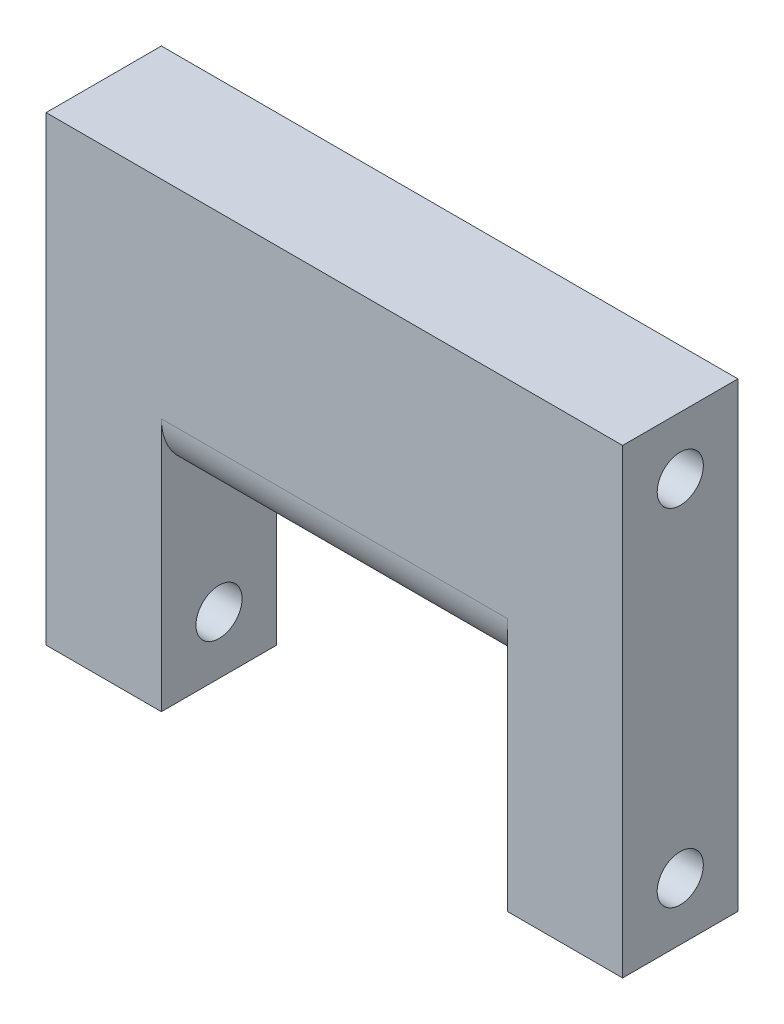
ISO-10303-21;
HEADER;
FILE_DESCRIPTION(('STEP AP214'),'2;1');
FILE_NAME('part.step','',(''),(''),'','','');
FILE_SCHEMA(('AUTOMOTIVE_DESIGN { 1 0 10303 214 1 1 1 1 }'));
ENDSEC;
DATA;
#1=APPLICATION_CONTEXT('core data for automotive mechanical design processes');
#2=APPLICATION_PROTOCOL_DEFINITION('international standard','automotive_design',2000,#1);
#3=PRODUCT_CONTEXT('',#1,'mechanical');
#4=PRODUCT('Part','Part','',(#3));
#5=PRODUCT_RELATED_PRODUCT_CATEGORY('part','',(#4));
#6=PRODUCT_DEFINITION_FORMATION('','',#4);
#7=PRODUCT_DEFINITION_CONTEXT('part definition',#1,'design');
#8=PRODUCT_DEFINITION('design','',#6,#7);
#9=PRODUCT_DEFINITION_SHAPE('','',#8);
#10=(LENGTH_UNIT() NAMED_UNIT(*) SI_UNIT(.MILLI.,.METRE.));
#11=(NAMED_UNIT(*) PLANE_ANGLE_UNIT() SI_UNIT($,.RADIAN.));
#12=(NAMED_UNIT(*) SI_UNIT($,.STERADIAN.) SOLID_ANGLE_UNIT());
#13=UNCERTAINTY_MEASURE_WITH_UNIT(LENGTH_MEASURE(1.E-05),#10,'distance_accuracy_value','');
#14=(GEOMETRIC_REPRESENTATION_CONTEXT(3) GLOBAL_UNCERTAINTY_ASSIGNED_CONTEXT((#13)) GLOBAL_UNIT_ASSIGNED_CONTEXT((#10,
#11,#12)) REPRESENTATION_CONTEXT('',''));
#15=CARTESIAN_POINT('',(0.,0.,0.));
#16=DIRECTION('',(0.,0.,1.));
#17=DIRECTION('',(1.,0.,0.));
#18=AXIS2_PLACEMENT_3D('',#15,#16,#17);
#19=CARTESIAN_POINT('',(0.,0.,10.));
#20=DIRECTION('',(1.,0.,0.));
#21=DIRECTION('',(0.,0.,-1.));
#22=AXIS2_PLACEMENT_3D('',#19,#20,#21);
#23=PLANE('',#22);
#24=CARTESIAN_POINT('',(0.,35.,5.));
#25=DIRECTION('',(-1.,0.,0.));
#26=DIRECTION('',(0.,0.,1.));
#27=AXIS2_PLACEMENT_3D('',#24,#25,#26);
#28=CIRCLE('',#27,2.);
#29=CARTESIAN_POINT('',(0.,35.,7.));
#30=VERTEX_POINT('',#29);
#31=EDGE_CURVE('E186',#30,#30,#28,.T.);
#32=ORIENTED_EDGE('',*,*,#31,.F.);
#33=EDGE_LOOP('',(#32));
#34=FACE_BOUND('',#33,.T.);
#35=CARTESIAN_POINT('',(0.,5.,5.));
#36=DIRECTION('',(1.,0.,0.));
#37=DIRECTION('',(0.,0.,-1.));
#38=AXIS2_PLACEMENT_3D('',#35,#36,#37);
#39=CIRCLE('',#38,2.);
#40=CARTESIAN_POINT('',(0.,5.,3.));
#41=VERTEX_POINT('',#40);
#42=EDGE_CURVE('E179',#41,#41,#39,.T.);
#43=ORIENTED_EDGE('',*,*,#42,.T.);
#44=EDGE_LOOP('',(#43));
#45=FACE_BOUND('',#44,.T.);
#46=DIRECTION('',(0.,-1.,0.));
#47=VECTOR('',#46,1.);
#48=CARTESIAN_POINT('',(0.,0.,0.));
#49=LINE('',#48,#47);
#50=CARTESIAN_POINT('',(0.,40.,0.));
#51=VERTEX_POINT('',#50);
#52=CARTESIAN_POINT('',(0.,0.,0.));
#53=VERTEX_POINT('',#52);
#54=EDGE_CURVE('E127',#51,#53,#49,.T.);
#55=ORIENTED_EDGE('',*,*,#54,.T.);
#56=DIRECTION('',(0.,0.,-1.));
#57=VECTOR('',#56,1.);
#58=CARTESIAN_POINT('',(0.,0.,10.));
#59=LINE('',#58,#57);
#60=CARTESIAN_POINT('',(0.,0.,10.));
#61=VERTEX_POINT('',#60);
#62=EDGE_CURVE('E107',#61,#53,#59,.T.);
#63=ORIENTED_EDGE('',*,*,#62,.F.);
#64=DIRECTION('',(0.,-1.,0.));
#65=VECTOR('',#64,1.);
#66=CARTESIAN_POINT('',(0.,0.,10.));
#67=LINE('',#66,#65);
#68=CARTESIAN_POINT('',(0.,40.,10.));
#69=VERTEX_POINT('',#68);
#70=EDGE_CURVE('E114',#69,#61,#67,.T.);
#71=ORIENTED_EDGE('',*,*,#70,.F.);
#72=DIRECTION('',(0.,0.,-1.));
#73=VECTOR('',#72,1.);
#74=CARTESIAN_POINT('',(0.,40.,10.));
#75=LINE('',#74,#73);
#76=EDGE_CURVE('E147',#69,#51,#75,.T.);
#77=ORIENTED_EDGE('',*,*,#76,.T.);
#78=EDGE_LOOP('',(#55,#63,#71,#77));
#79=FACE_BOUND('',#78,.T.);
#80=ADVANCED_FACE('F33',(#34,#45,#79),#23,.F.);
#81=CARTESIAN_POINT('',(0.,0.,10.));
#82=DIRECTION('',(0.,1.,0.));
#83=DIRECTION('',(0.,0.,1.));
#84=AXIS2_PLACEMENT_3D('',#81,#82,#83);
#85=PLANE('',#84);
#86=DIRECTION('',(1.,0.,0.));
#87=VECTOR('',#86,1.);
#88=CARTESIAN_POINT('',(0.,0.,0.));
#89=LINE('',#88,#87);
#90=CARTESIAN_POINT('',(10.,0.,0.));
#91=VERTEX_POINT('',#90);
#92=EDGE_CURVE('E162',#53,#91,#89,.T.);
#93=ORIENTED_EDGE('',*,*,#92,.T.);
#94=DIRECTION('',(0.,0.,-1.));
#95=VECTOR('',#94,1.);
#96=CARTESIAN_POINT('',(10.,0.,10.));
#97=LINE('',#96,#95);
#98=CARTESIAN_POINT('',(10.,0.,10.));
#99=VERTEX_POINT('',#98);
#100=EDGE_CURVE('E110',#99,#91,#97,.T.);
#101=ORIENTED_EDGE('',*,*,#100,.F.);
#102=DIRECTION('',(1.,0.,0.));
#103=VECTOR('',#102,1.);
#104=CARTESIAN_POINT('',(0.,0.,10.));
#105=LINE('',#104,#103);
#106=EDGE_CURVE('E103',#61,#99,#105,.T.);
#107=ORIENTED_EDGE('',*,*,#106,.F.);
#108=ORIENTED_EDGE('',*,*,#62,.T.);
#109=EDGE_LOOP('',(#93,#101,#107,#108));
#110=FACE_BOUND('',#109,.T.);
#111=ADVANCED_FACE('F105',(#110),#85,.F.);
#112=CARTESIAN_POINT('',(10.,0.,10.));
#113=DIRECTION('',(-1.,0.,0.));
#114=DIRECTION('',(0.,0.,1.));
#115=AXIS2_PLACEMENT_3D('',#112,#113,#114);
#116=PLANE('',#115);
#117=CARTESIAN_POINT('',(10.,5.,5.));
#118=DIRECTION('',(-1.,0.,0.));
#119=DIRECTION('',(0.,0.,1.));
#120=AXIS2_PLACEMENT_3D('',#117,#118,#119);
#121=CIRCLE('',#120,2.);
#122=CARTESIAN_POINT('',(10.,5.,7.));
#123=VERTEX_POINT('',#122);
#124=EDGE_CURVE('E165',#123,#123,#121,.T.);
#125=ORIENTED_EDGE('',*,*,#124,.T.);
#126=EDGE_LOOP('',(#125));
#127=FACE_BOUND('',#126,.T.);
#128=DIRECTION('',(0.,1.,0.));
#129=VECTOR('',#128,1.);
#130=CARTESIAN_POINT('',(10.,0.,0.));
#131=LINE('',#130,#129);
#132=CARTESIAN_POINT('',(10.,17.,0.));
#133=VERTEX_POINT('',#132);
#134=EDGE_CURVE('E159',#91,#133,#131,.T.);
#135=ORIENTED_EDGE('',*,*,#134,.T.);
#136=DIRECTION('',(0.,0.,-1.));
#137=VECTOR('',#136,1.);
#138=CARTESIAN_POINT('',(10.,17.,10.));
#139=LINE('',#138,#137);
#140=CARTESIAN_POINT('',(10.,17.,5.));
#141=VERTEX_POINT('',#140);
#142=EDGE_CURVE('E131',#141,#133,#139,.T.);
#143=ORIENTED_EDGE('',*,*,#142,.F.);
#144=CARTESIAN_POINT('',(10.,22.,5.));
#145=DIRECTION('',(-1.,0.,0.));
#146=DIRECTION('',(0.,0.,1.));
#147=AXIS2_PLACEMENT_3D('',#144,#145,#146);
#148=CIRCLE('',#147,5.);
#149=CARTESIAN_POINT('',(10.,22.,10.));
#150=VERTEX_POINT('',#149);
#151=EDGE_CURVE('E11',#141,#150,#148,.T.);
#152=ORIENTED_EDGE('',*,*,#151,.T.);
#153=DIRECTION('',(0.,1.,0.));
#154=VECTOR('',#153,1.);
#155=CARTESIAN_POINT('',(10.,0.,10.));
#156=LINE('',#155,#154);
#157=EDGE_CURVE('E113',#99,#150,#156,.T.);
#158=ORIENTED_EDGE('',*,*,#157,.F.);
#159=ORIENTED_EDGE('',*,*,#100,.T.);
#160=EDGE_LOOP('',(#135,#143,#152,#158,#159));
#161=FACE_BOUND('',#160,.T.);
#162=ADVANCED_FACE('F212',(#127,#161),#116,.F.);
#163=CARTESIAN_POINT('',(10.,17.,10.));
#164=DIRECTION('',(0.,1.,0.));
#165=DIRECTION('',(0.,0.,1.));
#166=AXIS2_PLACEMENT_3D('',#163,#164,#165);
#167=PLANE('',#166);
#168=DIRECTION('',(0.,0.,-1.));
#169=VECTOR('',#168,1.);
#170=CARTESIAN_POINT('',(40.,17.,10.));
#171=LINE('',#170,#169);
#172=CARTESIAN_POINT('',(40.,17.,5.));
#173=VERTEX_POINT('',#172);
#174=CARTESIAN_POINT('',(40.,17.,0.));
#175=VERTEX_POINT('',#174);
#176=EDGE_CURVE('E136',#173,#175,#171,.T.);
#177=ORIENTED_EDGE('',*,*,#176,.F.);
#178=DIRECTION('',(1.,0.,0.));
#179=VECTOR('',#178,1.);
#180=CARTESIAN_POINT('',(10.,17.,5.));
#181=LINE('',#180,#179);
#182=EDGE_CURVE('E48',#173,#141,#181,.F.);
#183=ORIENTED_EDGE('',*,*,#182,.T.);
#184=ORIENTED_EDGE('',*,*,#142,.T.);
#185=DIRECTION('',(1.,0.,0.));
#186=VECTOR('',#185,1.);
#187=CARTESIAN_POINT('',(10.,17.,0.));
#188=LINE('',#187,#186);
#189=EDGE_CURVE('E156',#133,#175,#188,.T.);
#190=ORIENTED_EDGE('',*,*,#189,.T.);
#191=EDGE_LOOP('',(#177,#183,#184,#190));
#192=FACE_BOUND('',#191,.T.);
#193=ADVANCED_FACE('F215',(#192),#167,.F.);
#194=CARTESIAN_POINT('',(40.,0.,10.));
#195=DIRECTION('',(1.,0.,0.));
#196=DIRECTION('',(0.,0.,-1.));
#197=AXIS2_PLACEMENT_3D('',#194,#195,#196);
#198=PLANE('',#197);
#199=CARTESIAN_POINT('',(40.,5.,5.));
#200=DIRECTION('',(1.,0.,0.));
#201=DIRECTION('',(0.,0.,-1.));
#202=AXIS2_PLACEMENT_3D('',#199,#200,#201);
#203=CIRCLE('',#202,2.);
#204=CARTESIAN_POINT('',(40.,5.,3.));
#205=VERTEX_POINT('',#204);
#206=EDGE_CURVE('E176',#205,#205,#203,.T.);
#207=ORIENTED_EDGE('',*,*,#206,.T.);
#208=EDGE_LOOP('',(#207));
#209=FACE_BOUND('',#208,.T.);
#210=DIRECTION('',(0.,-1.,0.));
#211=VECTOR('',#210,1.);
#212=CARTESIAN_POINT('',(40.,0.,0.));
#213=LINE('',#212,#211);
#214=CARTESIAN_POINT('',(40.,0.,0.));
#215=VERTEX_POINT('',#214);
#216=EDGE_CURVE('E154',#175,#215,#213,.T.);
#217=ORIENTED_EDGE('',*,*,#216,.T.);
#218=DIRECTION('',(0.,0.,-1.));
#219=VECTOR('',#218,1.);
#220=CARTESIAN_POINT('',(40.,0.,10.));
#221=LINE('',#220,#219);
#222=CARTESIAN_POINT('',(40.,0.,10.));
#223=VERTEX_POINT('',#222);
#224=EDGE_CURVE('E138',#223,#215,#221,.T.);
#225=ORIENTED_EDGE('',*,*,#224,.F.);
#226=DIRECTION('',(0.,-1.,0.));
#227=VECTOR('',#226,1.);
#228=CARTESIAN_POINT('',(40.,0.,10.));
#229=LINE('',#228,#227);
#230=CARTESIAN_POINT('',(40.,22.,10.));
#231=VERTEX_POINT('',#230);
#232=EDGE_CURVE('E171',#231,#223,#229,.T.);
#233=ORIENTED_EDGE('',*,*,#232,.F.);
#234=CARTESIAN_POINT('',(40.,22.,5.));
#235=DIRECTION('',(1.,0.,0.));
#236=DIRECTION('',(0.,0.,-1.));
#237=AXIS2_PLACEMENT_3D('',#234,#235,#236);
#238=CIRCLE('',#237,5.);
#239=EDGE_CURVE('E41',#231,#173,#238,.T.);
#240=ORIENTED_EDGE('',*,*,#239,.T.);
#241=ORIENTED_EDGE('',*,*,#176,.T.);
#242=EDGE_LOOP('',(#217,#225,#233,#240,#241));
#243=FACE_BOUND('',#242,.T.);
#244=ADVANCED_FACE('F229',(#209,#243),#198,.F.);
#245=CARTESIAN_POINT('',(40.,0.,10.));
#246=DIRECTION('',(0.,1.,0.));
#247=DIRECTION('',(0.,0.,1.));
#248=AXIS2_PLACEMENT_3D('',#245,#246,#247);
#249=PLANE('',#248);
#250=DIRECTION('',(1.,0.,0.));
#251=VECTOR('',#250,1.);
#252=CARTESIAN_POINT('',(40.,0.,0.));
#253=LINE('',#252,#251);
#254=CARTESIAN_POINT('',(50.,0.,0.));
#255=VERTEX_POINT('',#254);
#256=EDGE_CURVE('E152',#215,#255,#253,.T.);
#257=ORIENTED_EDGE('',*,*,#256,.T.);
#258=DIRECTION('',(0.,0.,-1.));
#259=VECTOR('',#258,1.);
#260=CARTESIAN_POINT('',(50.,0.,10.));
#261=LINE('',#260,#259);
#262=CARTESIAN_POINT('',(50.,0.,10.));
#263=VERTEX_POINT('',#262);
#264=EDGE_CURVE('E141',#263,#255,#261,.T.);
#265=ORIENTED_EDGE('',*,*,#264,.F.);
#266=DIRECTION('',(1.,0.,0.));
#267=VECTOR('',#266,1.);
#268=CARTESIAN_POINT('',(40.,0.,10.));
#269=LINE('',#268,#267);
#270=EDGE_CURVE('E169',#223,#263,#269,.T.);
#271=ORIENTED_EDGE('',*,*,#270,.F.);
#272=ORIENTED_EDGE('',*,*,#224,.T.);
#273=EDGE_LOOP('',(#257,#265,#271,#272));
#274=FACE_BOUND('',#273,.T.);
#275=ADVANCED_FACE('F231',(#274),#249,.F.);
#276=CARTESIAN_POINT('',(50.,0.,10.));
#277=DIRECTION('',(-1.,0.,0.));
#278=DIRECTION('',(0.,0.,1.));
#279=AXIS2_PLACEMENT_3D('',#276,#277,#278);
#280=PLANE('',#279);
#281=CARTESIAN_POINT('',(50.,35.,5.));
#282=DIRECTION('',(-1.,0.,0.));
#283=DIRECTION('',(0.,0.,1.));
#284=AXIS2_PLACEMENT_3D('',#281,#282,#283);
#285=CIRCLE('',#284,2.);
#286=CARTESIAN_POINT('',(50.,35.,7.));
#287=VERTEX_POINT('',#286);
#288=EDGE_CURVE('E183',#287,#287,#285,.T.);
#289=ORIENTED_EDGE('',*,*,#288,.T.);
#290=EDGE_LOOP('',(#289));
#291=FACE_BOUND('',#290,.T.);
#292=CARTESIAN_POINT('',(50.,5.,5.));
#293=DIRECTION('',(1.,0.,0.));
#294=DIRECTION('',(0.,0.,-1.));
#295=AXIS2_PLACEMENT_3D('',#292,#293,#294);
#296=CIRCLE('',#295,2.);
#297=CARTESIAN_POINT('',(50.,5.,3.));
#298=VERTEX_POINT('',#297);
#299=EDGE_CURVE('E180',#298,#298,#296,.T.);
#300=ORIENTED_EDGE('',*,*,#299,.F.);
#301=EDGE_LOOP('',(#300));
#302=FACE_BOUND('',#301,.T.);
#303=DIRECTION('',(0.,1.,0.));
#304=VECTOR('',#303,1.);
#305=CARTESIAN_POINT('',(50.,0.,0.));
#306=LINE('',#305,#304);
#307=CARTESIAN_POINT('',(50.,40.,0.));
#308=VERTEX_POINT('',#307);
#309=EDGE_CURVE('E150',#255,#308,#306,.T.);
#310=ORIENTED_EDGE('',*,*,#309,.T.);
#311=DIRECTION('',(0.,0.,-1.));
#312=VECTOR('',#311,1.);
#313=CARTESIAN_POINT('',(50.,40.,10.));
#314=LINE('',#313,#312);
#315=CARTESIAN_POINT('',(50.,40.,10.));
#316=VERTEX_POINT('',#315);
#317=EDGE_CURVE('E144',#316,#308,#314,.T.);
#318=ORIENTED_EDGE('',*,*,#317,.F.);
#319=DIRECTION('',(0.,1.,0.));
#320=VECTOR('',#319,1.);
#321=CARTESIAN_POINT('',(50.,0.,10.));
#322=LINE('',#321,#320);
#323=EDGE_CURVE('E167',#263,#316,#322,.T.);
#324=ORIENTED_EDGE('',*,*,#323,.F.);
#325=ORIENTED_EDGE('',*,*,#264,.T.);
#326=EDGE_LOOP('',(#310,#318,#324,#325));
#327=FACE_BOUND('',#326,.T.);
#328=ADVANCED_FACE('F192',(#291,#302,#327),#280,.F.);
#329=CARTESIAN_POINT('',(0.,40.,10.));
#330=DIRECTION('',(0.,-1.,0.));
#331=DIRECTION('',(0.,0.,-1.));
#332=AXIS2_PLACEMENT_3D('',#329,#330,#331);
#333=PLANE('',#332);
#334=DIRECTION('',(-1.,0.,0.));
#335=VECTOR('',#334,1.);
#336=CARTESIAN_POINT('',(0.,40.,0.));
#337=LINE('',#336,#335);
#338=EDGE_CURVE('E124',#308,#51,#337,.T.);
#339=ORIENTED_EDGE('',*,*,#338,.T.);
#340=ORIENTED_EDGE('',*,*,#76,.F.);
#341=DIRECTION('',(-1.,0.,0.));
#342=VECTOR('',#341,1.);
#343=CARTESIAN_POINT('',(0.,40.,10.));
#344=LINE('',#343,#342);
#345=EDGE_CURVE('E120',#316,#69,#344,.T.);
#346=ORIENTED_EDGE('',*,*,#345,.F.);
#347=ORIENTED_EDGE('',*,*,#317,.T.);
#348=EDGE_LOOP('',(#339,#340,#346,#347));
#349=FACE_BOUND('',#348,.T.);
#350=ADVANCED_FACE('F238',(#349),#333,.F.);
#351=CARTESIAN_POINT('',(0.,40.,10.));
#352=DIRECTION('',(0.,0.,-1.));
#353=DIRECTION('',(-1.,0.,0.));
#354=AXIS2_PLACEMENT_3D('',#351,#352,#353);
#355=PLANE('',#354);
#356=DIRECTION('',(1.,0.,0.));
#357=VECTOR('',#356,1.);
#358=CARTESIAN_POINT('',(0.,22.,10.));
#359=LINE('',#358,#357);
#360=EDGE_CURVE('E128',#150,#231,#359,.T.);
#361=ORIENTED_EDGE('',*,*,#360,.T.);
#362=ORIENTED_EDGE('',*,*,#232,.T.);
#363=ORIENTED_EDGE('',*,*,#270,.T.);
#364=ORIENTED_EDGE('',*,*,#323,.T.);
#365=ORIENTED_EDGE('',*,*,#345,.T.);
#366=ORIENTED_EDGE('',*,*,#70,.T.);
#367=ORIENTED_EDGE('',*,*,#106,.T.);
#368=ORIENTED_EDGE('',*,*,#157,.T.);
#369=EDGE_LOOP('',(#361,#362,#363,#364,#365,#366,#367,#368));
#370=FACE_BOUND('',#369,.T.);
#371=ADVANCED_FACE('F118',(#370),#355,.F.);
#372=CARTESIAN_POINT('',(0.,40.,0.));
#373=DIRECTION('',(0.,0.,-1.));
#374=DIRECTION('',(-1.,0.,0.));
#375=AXIS2_PLACEMENT_3D('',#372,#373,#374);
#376=PLANE('',#375);
#377=ORIENTED_EDGE('',*,*,#54,.F.);
#378=ORIENTED_EDGE('',*,*,#338,.F.);
#379=ORIENTED_EDGE('',*,*,#309,.F.);
#380=ORIENTED_EDGE('',*,*,#256,.F.);
#381=ORIENTED_EDGE('',*,*,#216,.F.);
#382=ORIENTED_EDGE('',*,*,#189,.F.);
#383=ORIENTED_EDGE('',*,*,#134,.F.);
#384=ORIENTED_EDGE('',*,*,#92,.F.);
#385=EDGE_LOOP('',(#377,#378,#379,#380,#381,#382,#383,#384));
#386=FACE_BOUND('',#385,.T.);
#387=ADVANCED_FACE('F222',(#386),#376,.T.);
#388=CARTESIAN_POINT('',(0.,5.,5.));
#389=DIRECTION('',(1.,0.,0.));
#390=DIRECTION('',(0.,0.,-1.));
#391=AXIS2_PLACEMENT_3D('',#388,#389,#390);
#392=CYLINDRICAL_SURFACE('',#391,2.);
#393=ORIENTED_EDGE('',*,*,#299,.T.);
#394=EDGE_LOOP('',(#393));
#395=FACE_BOUND('',#394,.T.);
#396=ORIENTED_EDGE('',*,*,#206,.F.);
#397=EDGE_LOOP('',(#396));
#398=FACE_BOUND('',#397,.T.);
#399=ADVANCED_FACE('F208',(#395,#398),#392,.F.);
#400=ORIENTED_EDGE('',*,*,#42,.F.);
#401=EDGE_LOOP('',(#400));
#402=FACE_BOUND('',#401,.T.);
#403=ORIENTED_EDGE('',*,*,#124,.F.);
#404=EDGE_LOOP('',(#403));
#405=FACE_BOUND('',#404,.T.);
#406=ADVANCED_FACE('F205',(#402,#405),#392,.F.);
#407=CARTESIAN_POINT('',(0.,22.,5.));
#408=DIRECTION('',(1.,0.,0.));
#409=DIRECTION('',(0.,0.,-1.));
#410=AXIS2_PLACEMENT_3D('',#407,#408,#409);
#411=CYLINDRICAL_SURFACE('',#410,5.);
#412=ORIENTED_EDGE('',*,*,#151,.F.);
#413=ORIENTED_EDGE('',*,*,#182,.F.);
#414=ORIENTED_EDGE('',*,*,#239,.F.);
#415=ORIENTED_EDGE('',*,*,#360,.F.);
#416=EDGE_LOOP('',(#412,#413,#414,#415));
#417=FACE_BOUND('',#416,.T.);
#418=ADVANCED_FACE('F35',(#417),#411,.T.);
#419=CARTESIAN_POINT('',(50.,35.,5.));
#420=DIRECTION('',(-1.,0.,0.));
#421=DIRECTION('',(0.,0.,1.));
#422=AXIS2_PLACEMENT_3D('',#419,#420,#421);
#423=CYLINDRICAL_SURFACE('',#422,2.);
#424=ORIENTED_EDGE('',*,*,#288,.F.);
#425=EDGE_LOOP('',(#424));
#426=FACE_BOUND('',#425,.T.);
#427=ORIENTED_EDGE('',*,*,#31,.T.);
#428=EDGE_LOOP('',(#427));
#429=FACE_BOUND('',#428,.T.);
#430=ADVANCED_FACE('F195',(#426,#429),#423,.F.);
#431=CLOSED_SHELL('',(#80,#111,#162,#193,#244,#275,#328,#350,#371,#387,#399,#406,#418,#430));
#432=MANIFOLD_SOLID_BREP('B2',#431);
#433=ADVANCED_BREP_SHAPE_REPRESENTATION('',(#18,#432),#14);
#434=SHAPE_DEFINITION_REPRESENTATION(#9,#433);
ENDSEC;
END-ISO-10303-21;
